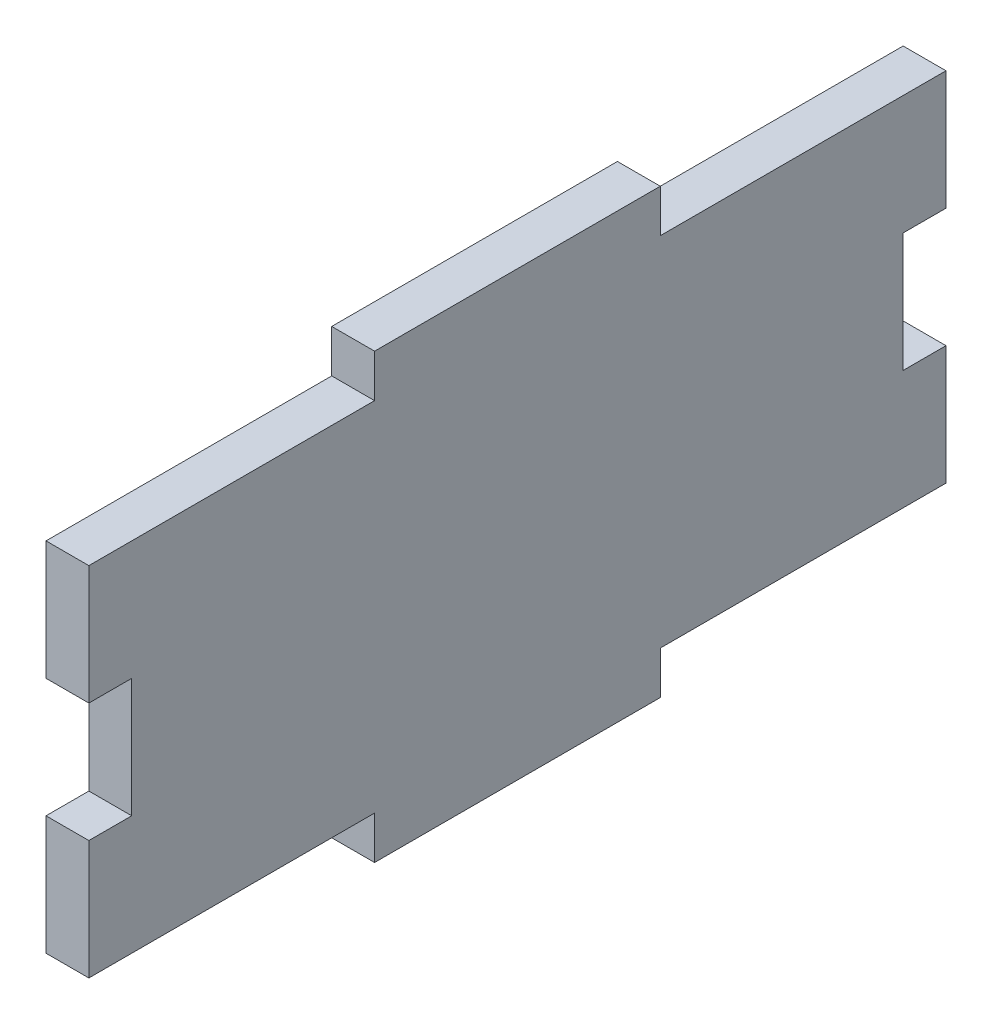
ISO-10303-21;
HEADER;
FILE_DESCRIPTION(('STEP AP214'),'2;1');
FILE_NAME('part.step','',(''),(''),'','','');
FILE_SCHEMA(('AUTOMOTIVE_DESIGN { 1 0 10303 214 1 1 1 1 }'));
ENDSEC;
DATA;
#1=APPLICATION_CONTEXT('core data for automotive mechanical design processes');
#2=APPLICATION_PROTOCOL_DEFINITION('international standard','automotive_design',2000,#1);
#3=PRODUCT_CONTEXT('',#1,'mechanical');
#4=PRODUCT('Part','Part','',(#3));
#5=PRODUCT_RELATED_PRODUCT_CATEGORY('part','',(#4));
#6=PRODUCT_DEFINITION_FORMATION('','',#4);
#7=PRODUCT_DEFINITION_CONTEXT('part definition',#1,'design');
#8=PRODUCT_DEFINITION('design','',#6,#7);
#9=PRODUCT_DEFINITION_SHAPE('','',#8);
#10=(LENGTH_UNIT() NAMED_UNIT(*) SI_UNIT(.MILLI.,.METRE.));
#11=(NAMED_UNIT(*) PLANE_ANGLE_UNIT() SI_UNIT($,.RADIAN.));
#12=(NAMED_UNIT(*) SI_UNIT($,.STERADIAN.) SOLID_ANGLE_UNIT());
#13=UNCERTAINTY_MEASURE_WITH_UNIT(LENGTH_MEASURE(1.E-05),#10,'distance_accuracy_value','');
#14=(GEOMETRIC_REPRESENTATION_CONTEXT(3) GLOBAL_UNCERTAINTY_ASSIGNED_CONTEXT((#13)) GLOBAL_UNIT_ASSIGNED_CONTEXT((#10,
#11,#12)) REPRESENTATION_CONTEXT('',''));
#15=CARTESIAN_POINT('',(0.,0.,0.));
#16=DIRECTION('',(0.,0.,1.));
#17=DIRECTION('',(1.,0.,0.));
#18=AXIS2_PLACEMENT_3D('',#15,#16,#17);
#19=CARTESIAN_POINT('',(3.,0.,0.));
#20=DIRECTION('',(0.,0.,-1.));
#21=DIRECTION('',(0.,1.,0.));
#22=AXIS2_PLACEMENT_3D('',#19,#20,#21);
#23=PLANE('',#22);
#24=DIRECTION('',(0.,-1.,0.));
#25=VECTOR('',#24,1.);
#26=CARTESIAN_POINT('',(0.,0.,0.));
#27=LINE('',#26,#25);
#28=CARTESIAN_POINT('',(0.,8.33333333,0.));
#29=VERTEX_POINT('',#28);
#30=CARTESIAN_POINT('',(0.,0.,0.));
#31=VERTEX_POINT('',#30);
#32=EDGE_CURVE('E201',#29,#31,#27,.T.);
#33=ORIENTED_EDGE('',*,*,#32,.T.);
#34=DIRECTION('',(-1.,0.,0.));
#35=VECTOR('',#34,1.);
#36=CARTESIAN_POINT('',(3.,0.,0.));
#37=LINE('',#36,#35);
#38=CARTESIAN_POINT('',(3.,0.,0.));
#39=VERTEX_POINT('',#38);
#40=EDGE_CURVE('E11',#39,#31,#37,.T.);
#41=ORIENTED_EDGE('',*,*,#40,.F.);
#42=DIRECTION('',(0.,-1.,0.));
#43=VECTOR('',#42,1.);
#44=CARTESIAN_POINT('',(3.,0.,0.));
#45=LINE('',#44,#43);
#46=CARTESIAN_POINT('',(3.,8.33333333,0.));
#47=VERTEX_POINT('',#46);
#48=EDGE_CURVE('E239',#47,#39,#45,.T.);
#49=ORIENTED_EDGE('',*,*,#48,.F.);
#50=DIRECTION('',(-1.,0.,0.));
#51=VECTOR('',#50,1.);
#52=CARTESIAN_POINT('',(3.,8.33333333,0.));
#53=LINE('',#52,#51);
#54=EDGE_CURVE('E197',#47,#29,#53,.T.);
#55=ORIENTED_EDGE('',*,*,#54,.T.);
#56=EDGE_LOOP('',(#33,#41,#49,#55));
#57=FACE_BOUND('',#56,.T.);
#58=ADVANCED_FACE('F33',(#57),#23,.F.);
#59=CARTESIAN_POINT('',(3.,0.,0.));
#60=DIRECTION('',(0.,1.,0.));
#61=DIRECTION('',(0.,0.,1.));
#62=AXIS2_PLACEMENT_3D('',#59,#60,#61);
#63=PLANE('',#62);
#64=DIRECTION('',(0.,0.,-1.));
#65=VECTOR('',#64,1.);
#66=CARTESIAN_POINT('',(0.,0.,0.));
#67=LINE('',#66,#65);
#68=CARTESIAN_POINT('',(0.,0.,-20.));
#69=VERTEX_POINT('',#68);
#70=EDGE_CURVE('E204',#31,#69,#67,.T.);
#71=ORIENTED_EDGE('',*,*,#70,.T.);
#72=DIRECTION('',(-1.,0.,0.));
#73=VECTOR('',#72,1.);
#74=CARTESIAN_POINT('',(3.,0.,-20.));
#75=LINE('',#74,#73);
#76=CARTESIAN_POINT('',(3.,0.,-20.));
#77=VERTEX_POINT('',#76);
#78=EDGE_CURVE('E41',#77,#69,#75,.T.);
#79=ORIENTED_EDGE('',*,*,#78,.F.);
#80=DIRECTION('',(0.,0.,-1.));
#81=VECTOR('',#80,1.);
#82=CARTESIAN_POINT('',(3.,0.,0.));
#83=LINE('',#82,#81);
#84=EDGE_CURVE('E128',#39,#77,#83,.T.);
#85=ORIENTED_EDGE('',*,*,#84,.F.);
#86=ORIENTED_EDGE('',*,*,#40,.T.);
#87=EDGE_LOOP('',(#71,#79,#85,#86));
#88=FACE_BOUND('',#87,.T.);
#89=ADVANCED_FACE('F357',(#88),#63,.F.);
#90=CARTESIAN_POINT('',(3.,0.,-20.));
#91=DIRECTION('',(0.,0.,-1.));
#92=DIRECTION('',(-1.,0.,0.));
#93=AXIS2_PLACEMENT_3D('',#90,#91,#92);
#94=PLANE('',#93);
#95=DIRECTION('',(0.,-1.,0.));
#96=VECTOR('',#95,1.);
#97=CARTESIAN_POINT('',(0.,0.,-20.));
#98=LINE('',#97,#96);
#99=CARTESIAN_POINT('',(0.,-3.,-20.));
#100=VERTEX_POINT('',#99);
#101=EDGE_CURVE('E206',#69,#100,#98,.T.);
#102=ORIENTED_EDGE('',*,*,#101,.T.);
#103=DIRECTION('',(-1.,0.,0.));
#104=VECTOR('',#103,1.);
#105=CARTESIAN_POINT('',(3.,-3.,-20.));
#106=LINE('',#105,#104);
#107=CARTESIAN_POINT('',(3.,-3.,-20.));
#108=VERTEX_POINT('',#107);
#109=EDGE_CURVE('E282',#108,#100,#106,.T.);
#110=ORIENTED_EDGE('',*,*,#109,.F.);
#111=DIRECTION('',(0.,-1.,0.));
#112=VECTOR('',#111,1.);
#113=CARTESIAN_POINT('',(3.,0.,-20.));
#114=LINE('',#113,#112);
#115=EDGE_CURVE('E290',#77,#108,#114,.T.);
#116=ORIENTED_EDGE('',*,*,#115,.F.);
#117=ORIENTED_EDGE('',*,*,#78,.T.);
#118=EDGE_LOOP('',(#102,#110,#116,#117));
#119=FACE_BOUND('',#118,.T.);
#120=ADVANCED_FACE('F288',(#119),#94,.F.);
#121=CARTESIAN_POINT('',(3.,-3.,-20.));
#122=DIRECTION('',(0.,1.,0.));
#123=DIRECTION('',(0.,0.,1.));
#124=AXIS2_PLACEMENT_3D('',#121,#122,#123);
#125=PLANE('',#124);
#126=DIRECTION('',(0.,0.,-1.));
#127=VECTOR('',#126,1.);
#128=CARTESIAN_POINT('',(0.,-3.,-20.));
#129=LINE('',#128,#127);
#130=CARTESIAN_POINT('',(0.,-3.,-40.));
#131=VERTEX_POINT('',#130);
#132=EDGE_CURVE('E208',#100,#131,#129,.T.);
#133=ORIENTED_EDGE('',*,*,#132,.T.);
#134=DIRECTION('',(-1.,0.,0.));
#135=VECTOR('',#134,1.);
#136=CARTESIAN_POINT('',(3.,-3.,-40.));
#137=LINE('',#136,#135);
#138=CARTESIAN_POINT('',(3.,-3.,-40.));
#139=VERTEX_POINT('',#138);
#140=EDGE_CURVE('E279',#139,#131,#137,.T.);
#141=ORIENTED_EDGE('',*,*,#140,.F.);
#142=DIRECTION('',(0.,0.,-1.));
#143=VECTOR('',#142,1.);
#144=CARTESIAN_POINT('',(3.,-3.,-20.));
#145=LINE('',#144,#143);
#146=EDGE_CURVE('E308',#108,#139,#145,.T.);
#147=ORIENTED_EDGE('',*,*,#146,.F.);
#148=ORIENTED_EDGE('',*,*,#109,.T.);
#149=EDGE_LOOP('',(#133,#141,#147,#148));
#150=FACE_BOUND('',#149,.T.);
#151=ADVANCED_FACE('F299',(#150),#125,.F.);
#152=CARTESIAN_POINT('',(3.,0.,-40.));
#153=DIRECTION('',(0.,0.,1.));
#154=DIRECTION('',(1.,0.,0.));
#155=AXIS2_PLACEMENT_3D('',#152,#153,#154);
#156=PLANE('',#155);
#157=DIRECTION('',(0.,1.,0.));
#158=VECTOR('',#157,1.);
#159=CARTESIAN_POINT('',(0.,0.,-40.));
#160=LINE('',#159,#158);
#161=CARTESIAN_POINT('',(0.,0.,-40.));
#162=VERTEX_POINT('',#161);
#163=EDGE_CURVE('E210',#131,#162,#160,.T.);
#164=ORIENTED_EDGE('',*,*,#163,.T.);
#165=DIRECTION('',(-1.,0.,0.));
#166=VECTOR('',#165,1.);
#167=CARTESIAN_POINT('',(3.,0.,-40.));
#168=LINE('',#167,#166);
#169=CARTESIAN_POINT('',(3.,0.,-40.));
#170=VERTEX_POINT('',#169);
#171=EDGE_CURVE('E276',#170,#162,#168,.T.);
#172=ORIENTED_EDGE('',*,*,#171,.F.);
#173=DIRECTION('',(0.,1.,0.));
#174=VECTOR('',#173,1.);
#175=CARTESIAN_POINT('',(3.,0.,-40.));
#176=LINE('',#175,#174);
#177=EDGE_CURVE('E305',#139,#170,#176,.T.);
#178=ORIENTED_EDGE('',*,*,#177,.F.);
#179=ORIENTED_EDGE('',*,*,#140,.T.);
#180=EDGE_LOOP('',(#164,#172,#178,#179));
#181=FACE_BOUND('',#180,.T.);
#182=ADVANCED_FACE('F303',(#181),#156,.F.);
#183=CARTESIAN_POINT('',(3.,0.,-40.));
#184=DIRECTION('',(0.,1.,0.));
#185=DIRECTION('',(0.,0.,1.));
#186=AXIS2_PLACEMENT_3D('',#183,#184,#185);
#187=PLANE('',#186);
#188=DIRECTION('',(0.,0.,-1.));
#189=VECTOR('',#188,1.);
#190=CARTESIAN_POINT('',(0.,0.,-40.));
#191=LINE('',#190,#189);
#192=CARTESIAN_POINT('',(0.,0.,-60.));
#193=VERTEX_POINT('',#192);
#194=EDGE_CURVE('E212',#162,#193,#191,.T.);
#195=ORIENTED_EDGE('',*,*,#194,.T.);
#196=DIRECTION('',(-1.,0.,0.));
#197=VECTOR('',#196,1.);
#198=CARTESIAN_POINT('',(3.,0.,-60.));
#199=LINE('',#198,#197);
#200=CARTESIAN_POINT('',(3.,0.,-60.));
#201=VERTEX_POINT('',#200);
#202=EDGE_CURVE('E273',#201,#193,#199,.T.);
#203=ORIENTED_EDGE('',*,*,#202,.F.);
#204=DIRECTION('',(0.,0.,-1.));
#205=VECTOR('',#204,1.);
#206=CARTESIAN_POINT('',(3.,0.,-40.));
#207=LINE('',#206,#205);
#208=EDGE_CURVE('E307',#170,#201,#207,.T.);
#209=ORIENTED_EDGE('',*,*,#208,.F.);
#210=ORIENTED_EDGE('',*,*,#171,.T.);
#211=EDGE_LOOP('',(#195,#203,#209,#210));
#212=FACE_BOUND('',#211,.T.);
#213=ADVANCED_FACE('F370',(#212),#187,.F.);
#214=CARTESIAN_POINT('',(3.,0.,-60.));
#215=DIRECTION('',(0.,0.,1.));
#216=DIRECTION('',(1.,0.,0.));
#217=AXIS2_PLACEMENT_3D('',#214,#215,#216);
#218=PLANE('',#217);
#219=DIRECTION('',(0.,1.,0.));
#220=VECTOR('',#219,1.);
#221=CARTESIAN_POINT('',(0.,0.,-60.));
#222=LINE('',#221,#220);
#223=CARTESIAN_POINT('',(0.,8.33333333,-60.));
#224=VERTEX_POINT('',#223);
#225=EDGE_CURVE('E214',#193,#224,#222,.T.);
#226=ORIENTED_EDGE('',*,*,#225,.T.);
#227=DIRECTION('',(-1.,0.,0.));
#228=VECTOR('',#227,1.);
#229=CARTESIAN_POINT('',(3.,8.33333333,-60.));
#230=LINE('',#229,#228);
#231=CARTESIAN_POINT('',(3.,8.33333333,-60.));
#232=VERTEX_POINT('',#231);
#233=EDGE_CURVE('E270',#232,#224,#230,.T.);
#234=ORIENTED_EDGE('',*,*,#233,.F.);
#235=DIRECTION('',(0.,1.,0.));
#236=VECTOR('',#235,1.);
#237=CARTESIAN_POINT('',(3.,0.,-60.));
#238=LINE('',#237,#236);
#239=EDGE_CURVE('E310',#201,#232,#238,.T.);
#240=ORIENTED_EDGE('',*,*,#239,.F.);
#241=ORIENTED_EDGE('',*,*,#202,.T.);
#242=EDGE_LOOP('',(#226,#234,#240,#241));
#243=FACE_BOUND('',#242,.T.);
#244=ADVANCED_FACE('F373',(#243),#218,.F.);
#245=CARTESIAN_POINT('',(3.,8.33333333,-60.));
#246=DIRECTION('',(0.,-1.,0.));
#247=DIRECTION('',(0.,0.,-1.));
#248=AXIS2_PLACEMENT_3D('',#245,#246,#247);
#249=PLANE('',#248);
#250=DIRECTION('',(0.,0.,1.));
#251=VECTOR('',#250,1.);
#252=CARTESIAN_POINT('',(0.,8.33333333,-60.));
#253=LINE('',#252,#251);
#254=CARTESIAN_POINT('',(0.,8.33333333,-57.));
#255=VERTEX_POINT('',#254);
#256=EDGE_CURVE('E216',#224,#255,#253,.T.);
#257=ORIENTED_EDGE('',*,*,#256,.T.);
#258=DIRECTION('',(-1.,0.,0.));
#259=VECTOR('',#258,1.);
#260=CARTESIAN_POINT('',(3.,8.33333333,-57.));
#261=LINE('',#260,#259);
#262=CARTESIAN_POINT('',(3.,8.33333333,-57.));
#263=VERTEX_POINT('',#262);
#264=EDGE_CURVE('E267',#263,#255,#261,.T.);
#265=ORIENTED_EDGE('',*,*,#264,.F.);
#266=DIRECTION('',(0.,0.,1.));
#267=VECTOR('',#266,1.);
#268=CARTESIAN_POINT('',(3.,8.33333333,-60.));
#269=LINE('',#268,#267);
#270=EDGE_CURVE('E316',#232,#263,#269,.T.);
#271=ORIENTED_EDGE('',*,*,#270,.F.);
#272=ORIENTED_EDGE('',*,*,#233,.T.);
#273=EDGE_LOOP('',(#257,#265,#271,#272));
#274=FACE_BOUND('',#273,.T.);
#275=ADVANCED_FACE('F377',(#274),#249,.F.);
#276=CARTESIAN_POINT('',(3.,16.66666666,-57.));
#277=DIRECTION('',(0.,0.,1.));
#278=DIRECTION('',(1.,0.,0.));
#279=AXIS2_PLACEMENT_3D('',#276,#277,#278);
#280=PLANE('',#279);
#281=DIRECTION('',(0.,1.,0.));
#282=VECTOR('',#281,1.);
#283=CARTESIAN_POINT('',(0.,16.66666666,-57.));
#284=LINE('',#283,#282);
#285=CARTESIAN_POINT('',(0.,16.66666666,-57.));
#286=VERTEX_POINT('',#285);
#287=EDGE_CURVE('E218',#255,#286,#284,.T.);
#288=ORIENTED_EDGE('',*,*,#287,.T.);
#289=DIRECTION('',(-1.,0.,0.));
#290=VECTOR('',#289,1.);
#291=CARTESIAN_POINT('',(3.,16.66666666,-57.));
#292=LINE('',#291,#290);
#293=CARTESIAN_POINT('',(3.,16.66666666,-57.));
#294=VERTEX_POINT('',#293);
#295=EDGE_CURVE('E264',#294,#286,#292,.T.);
#296=ORIENTED_EDGE('',*,*,#295,.F.);
#297=DIRECTION('',(0.,1.,0.));
#298=VECTOR('',#297,1.);
#299=CARTESIAN_POINT('',(3.,16.66666666,-57.));
#300=LINE('',#299,#298);
#301=EDGE_CURVE('E318',#263,#294,#300,.T.);
#302=ORIENTED_EDGE('',*,*,#301,.F.);
#303=ORIENTED_EDGE('',*,*,#264,.T.);
#304=EDGE_LOOP('',(#288,#296,#302,#303));
#305=FACE_BOUND('',#304,.T.);
#306=ADVANCED_FACE('F381',(#305),#280,.F.);
#307=CARTESIAN_POINT('',(3.,16.66666666,-60.));
#308=DIRECTION('',(0.,1.,0.));
#309=DIRECTION('',(0.,0.,1.));
#310=AXIS2_PLACEMENT_3D('',#307,#308,#309);
#311=PLANE('',#310);
#312=DIRECTION('',(0.,0.,-1.));
#313=VECTOR('',#312,1.);
#314=CARTESIAN_POINT('',(0.,16.66666666,-60.));
#315=LINE('',#314,#313);
#316=CARTESIAN_POINT('',(0.,16.66666666,-60.));
#317=VERTEX_POINT('',#316);
#318=EDGE_CURVE('E220',#286,#317,#315,.T.);
#319=ORIENTED_EDGE('',*,*,#318,.T.);
#320=DIRECTION('',(-1.,0.,0.));
#321=VECTOR('',#320,1.);
#322=CARTESIAN_POINT('',(3.,16.66666666,-60.));
#323=LINE('',#322,#321);
#324=CARTESIAN_POINT('',(3.,16.66666666,-60.));
#325=VERTEX_POINT('',#324);
#326=EDGE_CURVE('E261',#325,#317,#323,.T.);
#327=ORIENTED_EDGE('',*,*,#326,.F.);
#328=DIRECTION('',(0.,0.,-1.));
#329=VECTOR('',#328,1.);
#330=CARTESIAN_POINT('',(3.,16.66666666,-60.));
#331=LINE('',#330,#329);
#332=EDGE_CURVE('E320',#294,#325,#331,.T.);
#333=ORIENTED_EDGE('',*,*,#332,.F.);
#334=ORIENTED_EDGE('',*,*,#295,.T.);
#335=EDGE_LOOP('',(#319,#327,#333,#334));
#336=FACE_BOUND('',#335,.T.);
#337=ADVANCED_FACE('F385',(#336),#311,.F.);
#338=CARTESIAN_POINT('',(3.,16.66666666,-60.));
#339=DIRECTION('',(0.,0.,1.));
#340=DIRECTION('',(1.,0.,0.));
#341=AXIS2_PLACEMENT_3D('',#338,#339,#340);
#342=PLANE('',#341);
#343=DIRECTION('',(0.,1.,0.));
#344=VECTOR('',#343,1.);
#345=CARTESIAN_POINT('',(0.,16.66666666,-60.));
#346=LINE('',#345,#344);
#347=CARTESIAN_POINT('',(0.,25.,-60.));
#348=VERTEX_POINT('',#347);
#349=EDGE_CURVE('E222',#317,#348,#346,.T.);
#350=ORIENTED_EDGE('',*,*,#349,.T.);
#351=DIRECTION('',(-1.,0.,0.));
#352=VECTOR('',#351,1.);
#353=CARTESIAN_POINT('',(3.,25.,-60.));
#354=LINE('',#353,#352);
#355=CARTESIAN_POINT('',(3.,25.,-60.));
#356=VERTEX_POINT('',#355);
#357=EDGE_CURVE('E258',#356,#348,#354,.T.);
#358=ORIENTED_EDGE('',*,*,#357,.F.);
#359=DIRECTION('',(0.,1.,0.));
#360=VECTOR('',#359,1.);
#361=CARTESIAN_POINT('',(3.,16.66666666,-60.));
#362=LINE('',#361,#360);
#363=EDGE_CURVE('E322',#325,#356,#362,.T.);
#364=ORIENTED_EDGE('',*,*,#363,.F.);
#365=ORIENTED_EDGE('',*,*,#326,.T.);
#366=EDGE_LOOP('',(#350,#358,#364,#365));
#367=FACE_BOUND('',#366,.T.);
#368=ADVANCED_FACE('F389',(#367),#342,.F.);
#369=CARTESIAN_POINT('',(3.,25.,-40.));
#370=DIRECTION('',(0.,-1.,0.));
#371=DIRECTION('',(0.,0.,-1.));
#372=AXIS2_PLACEMENT_3D('',#369,#370,#371);
#373=PLANE('',#372);
#374=DIRECTION('',(0.,0.,1.));
#375=VECTOR('',#374,1.);
#376=CARTESIAN_POINT('',(0.,25.,-40.));
#377=LINE('',#376,#375);
#378=CARTESIAN_POINT('',(0.,25.,-40.));
#379=VERTEX_POINT('',#378);
#380=EDGE_CURVE('E224',#348,#379,#377,.T.);
#381=ORIENTED_EDGE('',*,*,#380,.T.);
#382=DIRECTION('',(-1.,0.,0.));
#383=VECTOR('',#382,1.);
#384=CARTESIAN_POINT('',(3.,25.,-40.));
#385=LINE('',#384,#383);
#386=CARTESIAN_POINT('',(3.,25.,-40.));
#387=VERTEX_POINT('',#386);
#388=EDGE_CURVE('E255',#387,#379,#385,.T.);
#389=ORIENTED_EDGE('',*,*,#388,.F.);
#390=DIRECTION('',(0.,0.,1.));
#391=VECTOR('',#390,1.);
#392=CARTESIAN_POINT('',(3.,25.,-40.));
#393=LINE('',#392,#391);
#394=EDGE_CURVE('E324',#356,#387,#393,.T.);
#395=ORIENTED_EDGE('',*,*,#394,.F.);
#396=ORIENTED_EDGE('',*,*,#357,.T.);
#397=EDGE_LOOP('',(#381,#389,#395,#396));
#398=FACE_BOUND('',#397,.T.);
#399=ADVANCED_FACE('F393',(#398),#373,.F.);
#400=CARTESIAN_POINT('',(3.,25.,-40.));
#401=DIRECTION('',(0.,0.,1.));
#402=DIRECTION('',(1.,0.,0.));
#403=AXIS2_PLACEMENT_3D('',#400,#401,#402);
#404=PLANE('',#403);
#405=DIRECTION('',(0.,1.,0.));
#406=VECTOR('',#405,1.);
#407=CARTESIAN_POINT('',(0.,25.,-40.));
#408=LINE('',#407,#406);
#409=CARTESIAN_POINT('',(0.,28.,-40.));
#410=VERTEX_POINT('',#409);
#411=EDGE_CURVE('E226',#379,#410,#408,.T.);
#412=ORIENTED_EDGE('',*,*,#411,.T.);
#413=DIRECTION('',(-1.,0.,0.));
#414=VECTOR('',#413,1.);
#415=CARTESIAN_POINT('',(3.,28.,-40.));
#416=LINE('',#415,#414);
#417=CARTESIAN_POINT('',(3.,28.,-40.));
#418=VERTEX_POINT('',#417);
#419=EDGE_CURVE('E252',#418,#410,#416,.T.);
#420=ORIENTED_EDGE('',*,*,#419,.F.);
#421=DIRECTION('',(0.,1.,0.));
#422=VECTOR('',#421,1.);
#423=CARTESIAN_POINT('',(3.,25.,-40.));
#424=LINE('',#423,#422);
#425=EDGE_CURVE('E326',#387,#418,#424,.T.);
#426=ORIENTED_EDGE('',*,*,#425,.F.);
#427=ORIENTED_EDGE('',*,*,#388,.T.);
#428=EDGE_LOOP('',(#412,#420,#426,#427));
#429=FACE_BOUND('',#428,.T.);
#430=ADVANCED_FACE('F397',(#429),#404,.F.);
#431=CARTESIAN_POINT('',(3.,28.,-20.));
#432=DIRECTION('',(0.,-1.,0.));
#433=DIRECTION('',(0.,0.,-1.));
#434=AXIS2_PLACEMENT_3D('',#431,#432,#433);
#435=PLANE('',#434);
#436=DIRECTION('',(0.,0.,1.));
#437=VECTOR('',#436,1.);
#438=CARTESIAN_POINT('',(0.,28.,-20.));
#439=LINE('',#438,#437);
#440=CARTESIAN_POINT('',(0.,28.,-20.));
#441=VERTEX_POINT('',#440);
#442=EDGE_CURVE('E228',#410,#441,#439,.T.);
#443=ORIENTED_EDGE('',*,*,#442,.T.);
#444=DIRECTION('',(-1.,0.,0.));
#445=VECTOR('',#444,1.);
#446=CARTESIAN_POINT('',(3.,28.,-20.));
#447=LINE('',#446,#445);
#448=CARTESIAN_POINT('',(3.,28.,-20.));
#449=VERTEX_POINT('',#448);
#450=EDGE_CURVE('E249',#449,#441,#447,.T.);
#451=ORIENTED_EDGE('',*,*,#450,.F.);
#452=DIRECTION('',(0.,0.,1.));
#453=VECTOR('',#452,1.);
#454=CARTESIAN_POINT('',(3.,28.,-20.));
#455=LINE('',#454,#453);
#456=EDGE_CURVE('E328',#418,#449,#455,.T.);
#457=ORIENTED_EDGE('',*,*,#456,.F.);
#458=ORIENTED_EDGE('',*,*,#419,.T.);
#459=EDGE_LOOP('',(#443,#451,#457,#458));
#460=FACE_BOUND('',#459,.T.);
#461=ADVANCED_FACE('F401',(#460),#435,.F.);
#462=CARTESIAN_POINT('',(3.,25.,-20.));
#463=DIRECTION('',(0.,0.,-1.));
#464=DIRECTION('',(-1.,0.,0.));
#465=AXIS2_PLACEMENT_3D('',#462,#463,#464);
#466=PLANE('',#465);
#467=DIRECTION('',(0.,-1.,0.));
#468=VECTOR('',#467,1.);
#469=CARTESIAN_POINT('',(0.,25.,-20.));
#470=LINE('',#469,#468);
#471=CARTESIAN_POINT('',(0.,25.,-20.));
#472=VERTEX_POINT('',#471);
#473=EDGE_CURVE('E230',#441,#472,#470,.T.);
#474=ORIENTED_EDGE('',*,*,#473,.T.);
#475=DIRECTION('',(-1.,0.,0.));
#476=VECTOR('',#475,1.);
#477=CARTESIAN_POINT('',(3.,25.,-20.));
#478=LINE('',#477,#476);
#479=CARTESIAN_POINT('',(3.,25.,-20.));
#480=VERTEX_POINT('',#479);
#481=EDGE_CURVE('E246',#480,#472,#478,.T.);
#482=ORIENTED_EDGE('',*,*,#481,.F.);
#483=DIRECTION('',(0.,-1.,0.));
#484=VECTOR('',#483,1.);
#485=CARTESIAN_POINT('',(3.,25.,-20.));
#486=LINE('',#485,#484);
#487=EDGE_CURVE('E330',#449,#480,#486,.T.);
#488=ORIENTED_EDGE('',*,*,#487,.F.);
#489=ORIENTED_EDGE('',*,*,#450,.T.);
#490=EDGE_LOOP('',(#474,#482,#488,#489));
#491=FACE_BOUND('',#490,.T.);
#492=ADVANCED_FACE('F405',(#491),#466,.F.);
#493=CARTESIAN_POINT('',(3.,25.,0.));
#494=DIRECTION('',(0.,-1.,0.));
#495=DIRECTION('',(0.,0.,-1.));
#496=AXIS2_PLACEMENT_3D('',#493,#494,#495);
#497=PLANE('',#496);
#498=DIRECTION('',(0.,0.,1.));
#499=VECTOR('',#498,1.);
#500=CARTESIAN_POINT('',(0.,25.,0.));
#501=LINE('',#500,#499);
#502=CARTESIAN_POINT('',(0.,25.,0.));
#503=VERTEX_POINT('',#502);
#504=EDGE_CURVE('E232',#472,#503,#501,.T.);
#505=ORIENTED_EDGE('',*,*,#504,.T.);
#506=DIRECTION('',(-1.,0.,0.));
#507=VECTOR('',#506,1.);
#508=CARTESIAN_POINT('',(3.,25.,0.));
#509=LINE('',#508,#507);
#510=CARTESIAN_POINT('',(3.,25.,0.));
#511=VERTEX_POINT('',#510);
#512=EDGE_CURVE('E243',#511,#503,#509,.T.);
#513=ORIENTED_EDGE('',*,*,#512,.F.);
#514=DIRECTION('',(0.,0.,1.));
#515=VECTOR('',#514,1.);
#516=CARTESIAN_POINT('',(3.,25.,0.));
#517=LINE('',#516,#515);
#518=EDGE_CURVE('E332',#480,#511,#517,.T.);
#519=ORIENTED_EDGE('',*,*,#518,.F.);
#520=ORIENTED_EDGE('',*,*,#481,.T.);
#521=EDGE_LOOP('',(#505,#513,#519,#520));
#522=FACE_BOUND('',#521,.T.);
#523=ADVANCED_FACE('F338',(#522),#497,.F.);
#524=CARTESIAN_POINT('',(3.,16.66666666,0.));
#525=DIRECTION('',(0.,0.,-1.));
#526=DIRECTION('',(0.,1.,0.));
#527=AXIS2_PLACEMENT_3D('',#524,#525,#526);
#528=PLANE('',#527);
#529=DIRECTION('',(0.,-1.,0.));
#530=VECTOR('',#529,1.);
#531=CARTESIAN_POINT('',(0.,16.66666666,0.));
#532=LINE('',#531,#530);
#533=CARTESIAN_POINT('',(0.,16.66666666,0.));
#534=VERTEX_POINT('',#533);
#535=EDGE_CURVE('E234',#503,#534,#532,.T.);
#536=ORIENTED_EDGE('',*,*,#535,.T.);
#537=DIRECTION('',(-1.,0.,0.));
#538=VECTOR('',#537,1.);
#539=CARTESIAN_POINT('',(3.,16.66666666,0.));
#540=LINE('',#539,#538);
#541=CARTESIAN_POINT('',(3.,16.66666666,0.));
#542=VERTEX_POINT('',#541);
#543=EDGE_CURVE('E192',#542,#534,#540,.T.);
#544=ORIENTED_EDGE('',*,*,#543,.F.);
#545=DIRECTION('',(0.,-1.,0.));
#546=VECTOR('',#545,1.);
#547=CARTESIAN_POINT('',(3.,16.66666666,0.));
#548=LINE('',#547,#546);
#549=EDGE_CURVE('E183',#511,#542,#548,.T.);
#550=ORIENTED_EDGE('',*,*,#549,.F.);
#551=ORIENTED_EDGE('',*,*,#512,.T.);
#552=EDGE_LOOP('',(#536,#544,#550,#551));
#553=FACE_BOUND('',#552,.T.);
#554=ADVANCED_FACE('F342',(#553),#528,.F.);
#555=CARTESIAN_POINT('',(3.,16.66666666,0.));
#556=DIRECTION('',(0.,1.,0.));
#557=DIRECTION('',(0.,0.,1.));
#558=AXIS2_PLACEMENT_3D('',#555,#556,#557);
#559=PLANE('',#558);
#560=DIRECTION('',(0.,0.,-1.));
#561=VECTOR('',#560,1.);
#562=CARTESIAN_POINT('',(0.,16.66666666,0.));
#563=LINE('',#562,#561);
#564=CARTESIAN_POINT('',(0.,16.66666666,-2.99999999999999));
#565=VERTEX_POINT('',#564);
#566=EDGE_CURVE('E191',#534,#565,#563,.T.);
#567=ORIENTED_EDGE('',*,*,#566,.T.);
#568=DIRECTION('',(-1.,0.,0.));
#569=VECTOR('',#568,1.);
#570=CARTESIAN_POINT('',(3.,16.66666666,-2.99999999999999));
#571=LINE('',#570,#569);
#572=CARTESIAN_POINT('',(3.,16.66666666,-2.99999999999999));
#573=VERTEX_POINT('',#572);
#574=EDGE_CURVE('E188',#573,#565,#571,.T.);
#575=ORIENTED_EDGE('',*,*,#574,.F.);
#576=DIRECTION('',(0.,0.,-1.));
#577=VECTOR('',#576,1.);
#578=CARTESIAN_POINT('',(3.,16.66666666,0.));
#579=LINE('',#578,#577);
#580=EDGE_CURVE('E177',#542,#573,#579,.T.);
#581=ORIENTED_EDGE('',*,*,#580,.F.);
#582=ORIENTED_EDGE('',*,*,#543,.T.);
#583=EDGE_LOOP('',(#567,#575,#581,#582));
#584=FACE_BOUND('',#583,.T.);
#585=ADVANCED_FACE('F189',(#584),#559,.F.);
#586=CARTESIAN_POINT('',(3.,16.66666666,-2.99999999999999));
#587=DIRECTION('',(0.,0.,-1.));
#588=DIRECTION('',(0.,1.,0.));
#589=AXIS2_PLACEMENT_3D('',#586,#587,#588);
#590=PLANE('',#589);
#591=DIRECTION('',(0.,-1.,0.));
#592=VECTOR('',#591,1.);
#593=CARTESIAN_POINT('',(0.,16.66666666,-2.99999999999999));
#594=LINE('',#593,#592);
#595=CARTESIAN_POINT('',(0.,8.33333333,-3.));
#596=VERTEX_POINT('',#595);
#597=EDGE_CURVE('E114',#565,#596,#594,.T.);
#598=ORIENTED_EDGE('',*,*,#597,.T.);
#599=DIRECTION('',(-1.,0.,0.));
#600=VECTOR('',#599,1.);
#601=CARTESIAN_POINT('',(3.,8.33333333,-3.));
#602=LINE('',#601,#600);
#603=CARTESIAN_POINT('',(3.,8.33333333,-3.));
#604=VERTEX_POINT('',#603);
#605=EDGE_CURVE('E193',#604,#596,#602,.T.);
#606=ORIENTED_EDGE('',*,*,#605,.F.);
#607=DIRECTION('',(0.,-1.,0.));
#608=VECTOR('',#607,1.);
#609=CARTESIAN_POINT('',(3.,16.66666666,-2.99999999999999));
#610=LINE('',#609,#608);
#611=EDGE_CURVE('E181',#573,#604,#610,.T.);
#612=ORIENTED_EDGE('',*,*,#611,.F.);
#613=ORIENTED_EDGE('',*,*,#574,.T.);
#614=EDGE_LOOP('',(#598,#606,#612,#613));
#615=FACE_BOUND('',#614,.T.);
#616=ADVANCED_FACE('F195',(#615),#590,.F.);
#617=CARTESIAN_POINT('',(3.,8.33333333,0.));
#618=DIRECTION('',(0.,-1.,0.));
#619=DIRECTION('',(0.,0.,-1.));
#620=AXIS2_PLACEMENT_3D('',#617,#618,#619);
#621=PLANE('',#620);
#622=DIRECTION('',(0.,0.,1.));
#623=VECTOR('',#622,1.);
#624=CARTESIAN_POINT('',(0.,8.33333333,0.));
#625=LINE('',#624,#623);
#626=EDGE_CURVE('E120',#596,#29,#625,.T.);
#627=ORIENTED_EDGE('',*,*,#626,.T.);
#628=ORIENTED_EDGE('',*,*,#54,.F.);
#629=DIRECTION('',(0.,0.,1.));
#630=VECTOR('',#629,1.);
#631=CARTESIAN_POINT('',(3.,8.33333333,0.));
#632=LINE('',#631,#630);
#633=EDGE_CURVE('E49',#604,#47,#632,.T.);
#634=ORIENTED_EDGE('',*,*,#633,.F.);
#635=ORIENTED_EDGE('',*,*,#605,.T.);
#636=EDGE_LOOP('',(#627,#628,#634,#635));
#637=FACE_BOUND('',#636,.T.);
#638=ADVANCED_FACE('F346',(#637),#621,.F.);
#639=CARTESIAN_POINT('',(3.,0.,0.));
#640=DIRECTION('',(-1.,0.,0.));
#641=DIRECTION('',(0.,0.,1.));
#642=AXIS2_PLACEMENT_3D('',#639,#640,#641);
#643=PLANE('',#642);
#644=ORIENTED_EDGE('',*,*,#48,.T.);
#645=ORIENTED_EDGE('',*,*,#84,.T.);
#646=ORIENTED_EDGE('',*,*,#115,.T.);
#647=ORIENTED_EDGE('',*,*,#146,.T.);
#648=ORIENTED_EDGE('',*,*,#177,.T.);
#649=ORIENTED_EDGE('',*,*,#208,.T.);
#650=ORIENTED_EDGE('',*,*,#239,.T.);
#651=ORIENTED_EDGE('',*,*,#270,.T.);
#652=ORIENTED_EDGE('',*,*,#301,.T.);
#653=ORIENTED_EDGE('',*,*,#332,.T.);
#654=ORIENTED_EDGE('',*,*,#363,.T.);
#655=ORIENTED_EDGE('',*,*,#394,.T.);
#656=ORIENTED_EDGE('',*,*,#425,.T.);
#657=ORIENTED_EDGE('',*,*,#456,.T.);
#658=ORIENTED_EDGE('',*,*,#487,.T.);
#659=ORIENTED_EDGE('',*,*,#518,.T.);
#660=ORIENTED_EDGE('',*,*,#549,.T.);
#661=ORIENTED_EDGE('',*,*,#580,.T.);
#662=ORIENTED_EDGE('',*,*,#611,.T.);
#663=ORIENTED_EDGE('',*,*,#633,.T.);
#664=EDGE_LOOP('',(#644,#645,#646,#647,#648,#649,#650,#651,#652,#653,#654,#655,#656,#657,#658,
#659,#660,#661,#662,#663));
#665=FACE_BOUND('',#664,.T.);
#666=ADVANCED_FACE('F179',(#665),#643,.F.);
#667=CARTESIAN_POINT('',(0.,0.,0.));
#668=DIRECTION('',(-1.,0.,0.));
#669=DIRECTION('',(0.,0.,1.));
#670=AXIS2_PLACEMENT_3D('',#667,#668,#669);
#671=PLANE('',#670);
#672=ORIENTED_EDGE('',*,*,#32,.F.);
#673=ORIENTED_EDGE('',*,*,#626,.F.);
#674=ORIENTED_EDGE('',*,*,#597,.F.);
#675=ORIENTED_EDGE('',*,*,#566,.F.);
#676=ORIENTED_EDGE('',*,*,#535,.F.);
#677=ORIENTED_EDGE('',*,*,#504,.F.);
#678=ORIENTED_EDGE('',*,*,#473,.F.);
#679=ORIENTED_EDGE('',*,*,#442,.F.);
#680=ORIENTED_EDGE('',*,*,#411,.F.);
#681=ORIENTED_EDGE('',*,*,#380,.F.);
#682=ORIENTED_EDGE('',*,*,#349,.F.);
#683=ORIENTED_EDGE('',*,*,#318,.F.);
#684=ORIENTED_EDGE('',*,*,#287,.F.);
#685=ORIENTED_EDGE('',*,*,#256,.F.);
#686=ORIENTED_EDGE('',*,*,#225,.F.);
#687=ORIENTED_EDGE('',*,*,#194,.F.);
#688=ORIENTED_EDGE('',*,*,#163,.F.);
#689=ORIENTED_EDGE('',*,*,#132,.F.);
#690=ORIENTED_EDGE('',*,*,#101,.F.);
#691=ORIENTED_EDGE('',*,*,#70,.F.);
#692=EDGE_LOOP('',(#672,#673,#674,#675,#676,#677,#678,#679,#680,#681,#682,#683,#684,#685,#686,
#687,#688,#689,#690,#691));
#693=FACE_BOUND('',#692,.T.);
#694=ADVANCED_FACE('F294',(#693),#671,.T.);
#695=CLOSED_SHELL('',(#58,#89,#120,#151,#182,#213,#244,#275,#306,#337,#368,#399,#430,#461,#492,
#523,#554,#585,#616,#638,#666,#694));
#696=MANIFOLD_SOLID_BREP('B2',#695);
#697=ADVANCED_BREP_SHAPE_REPRESENTATION('',(#18,#696),#14);
#698=SHAPE_DEFINITION_REPRESENTATION(#9,#697);
ENDSEC;
END-ISO-10303-21;
